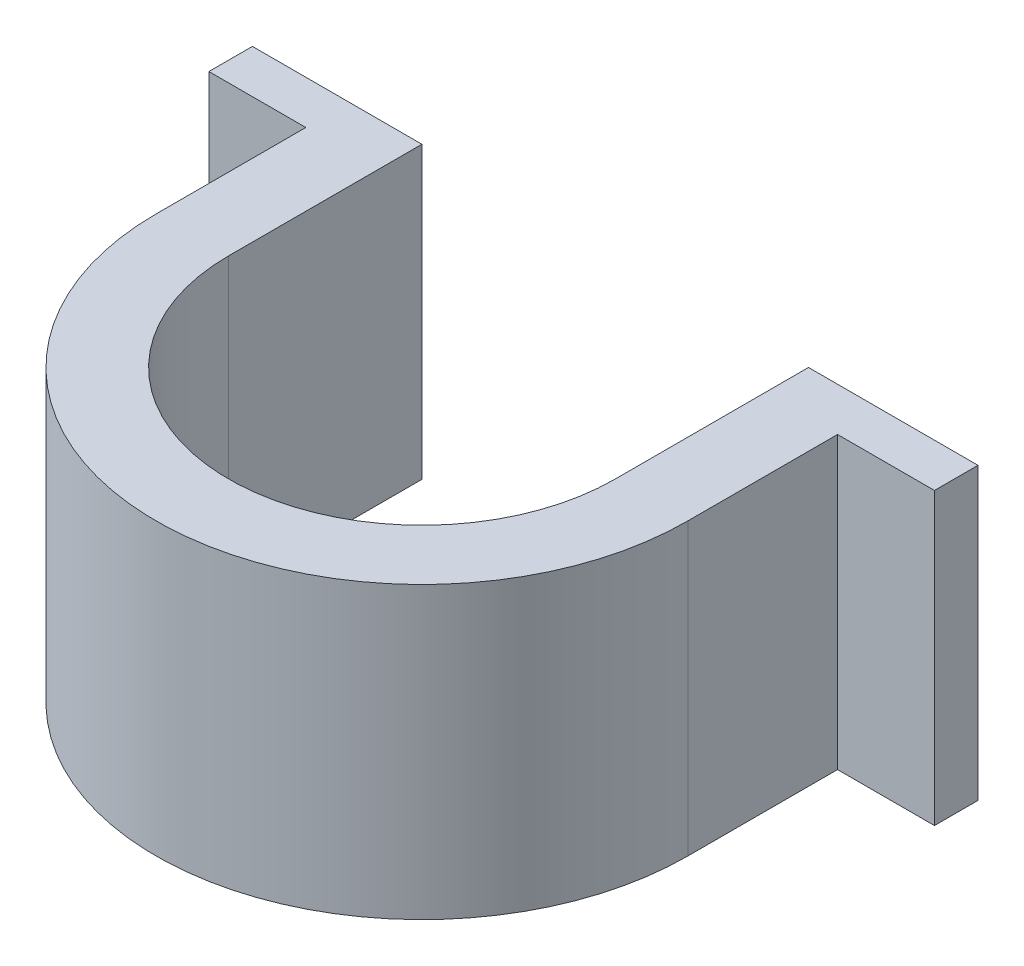
ISO-10303-21;
HEADER;
FILE_DESCRIPTION(('STEP AP214'),'2;1');
FILE_NAME('part.step','',(''),(''),'','','');
FILE_SCHEMA(('AUTOMOTIVE_DESIGN { 1 0 10303 214 1 1 1 1 }'));
ENDSEC;
DATA;
#1=APPLICATION_CONTEXT('core data for automotive mechanical design processes');
#2=APPLICATION_PROTOCOL_DEFINITION('international standard','automotive_design',2000,#1);
#3=PRODUCT_CONTEXT('',#1,'mechanical');
#4=PRODUCT('Part','Part','',(#3));
#5=PRODUCT_RELATED_PRODUCT_CATEGORY('part','',(#4));
#6=PRODUCT_DEFINITION_FORMATION('','',#4);
#7=PRODUCT_DEFINITION_CONTEXT('part definition',#1,'design');
#8=PRODUCT_DEFINITION('design','',#6,#7);
#9=PRODUCT_DEFINITION_SHAPE('','',#8);
#10=(LENGTH_UNIT() NAMED_UNIT(*) SI_UNIT(.MILLI.,.METRE.));
#11=(NAMED_UNIT(*) PLANE_ANGLE_UNIT() SI_UNIT($,.RADIAN.));
#12=(NAMED_UNIT(*) SI_UNIT($,.STERADIAN.) SOLID_ANGLE_UNIT());
#13=UNCERTAINTY_MEASURE_WITH_UNIT(LENGTH_MEASURE(1.E-05),#10,'distance_accuracy_value','');
#14=(GEOMETRIC_REPRESENTATION_CONTEXT(3) GLOBAL_UNCERTAINTY_ASSIGNED_CONTEXT((#13)) GLOBAL_UNIT_ASSIGNED_CONTEXT((#10,
#11,#12)) REPRESENTATION_CONTEXT('',''));
#15=CARTESIAN_POINT('',(0.,0.,0.));
#16=DIRECTION('',(0.,0.,1.));
#17=DIRECTION('',(1.,0.,0.));
#18=AXIS2_PLACEMENT_3D('',#15,#16,#17);
#19=CARTESIAN_POINT('',(-18.32,20.,0.));
#20=DIRECTION('',(-1.,0.,0.));
#21=DIRECTION('',(0.,0.,1.));
#22=AXIS2_PLACEMENT_3D('',#19,#20,#21);
#23=PLANE('',#22);
#24=DIRECTION('',(0.,0.,-1.));
#25=VECTOR('',#24,1.);
#26=CARTESIAN_POINT('',(-18.32,0.,0.));
#27=LINE('',#26,#25);
#28=CARTESIAN_POINT('',(-18.32,0.,0.));
#29=VERTEX_POINT('',#28);
#30=CARTESIAN_POINT('',(-18.32,0.,-10.32));
#31=VERTEX_POINT('',#30);
#32=EDGE_CURVE('E155',#29,#31,#27,.T.);
#33=ORIENTED_EDGE('',*,*,#32,.F.);
#34=DIRECTION('',(0.,-1.,0.));
#35=VECTOR('',#34,1.);
#36=CARTESIAN_POINT('',(-18.32,20.,0.));
#37=LINE('',#36,#35);
#38=CARTESIAN_POINT('',(-18.32,20.,0.));
#39=VERTEX_POINT('',#38);
#40=EDGE_CURVE('E11',#39,#29,#37,.T.);
#41=ORIENTED_EDGE('',*,*,#40,.F.);
#42=DIRECTION('',(0.,0.,-1.));
#43=VECTOR('',#42,1.);
#44=CARTESIAN_POINT('',(-18.32,20.,0.));
#45=LINE('',#44,#43);
#46=CARTESIAN_POINT('',(-18.32,20.,-10.32));
#47=VERTEX_POINT('',#46);
#48=EDGE_CURVE('E184',#39,#47,#45,.T.);
#49=ORIENTED_EDGE('',*,*,#48,.T.);
#50=DIRECTION('',(0.,-1.,0.));
#51=VECTOR('',#50,1.);
#52=CARTESIAN_POINT('',(-18.32,20.,-10.32));
#53=LINE('',#52,#51);
#54=EDGE_CURVE('E100',#47,#31,#53,.T.);
#55=ORIENTED_EDGE('',*,*,#54,.T.);
#56=EDGE_LOOP('',(#33,#41,#49,#55));
#57=FACE_BOUND('',#56,.T.);
#58=ADVANCED_FACE('F37',(#57),#23,.T.);
#59=CARTESIAN_POINT('',(0.,20.,0.));
#60=DIRECTION('',(0.,-1.,0.));
#61=DIRECTION('',(0.,0.,-1.));
#62=AXIS2_PLACEMENT_3D('',#59,#60,#61);
#63=CYLINDRICAL_SURFACE('',#62,18.32);
#64=CARTESIAN_POINT('',(0.,0.,0.));
#65=DIRECTION('',(0.,1.,0.));
#66=DIRECTION('',(0.,0.,1.));
#67=AXIS2_PLACEMENT_3D('',#64,#65,#66);
#68=CIRCLE('',#67,18.32);
#69=CARTESIAN_POINT('',(18.32,0.,0.));
#70=VERTEX_POINT('',#69);
#71=EDGE_CURVE('E158',#29,#70,#68,.T.);
#72=ORIENTED_EDGE('',*,*,#71,.T.);
#73=DIRECTION('',(0.,-1.,0.));
#74=VECTOR('',#73,1.);
#75=CARTESIAN_POINT('',(18.32,20.,0.));
#76=LINE('',#75,#74);
#77=CARTESIAN_POINT('',(18.32,20.,0.));
#78=VERTEX_POINT('',#77);
#79=EDGE_CURVE('E45',#78,#70,#76,.T.);
#80=ORIENTED_EDGE('',*,*,#79,.F.);
#81=CARTESIAN_POINT('',(0.,20.,0.));
#82=DIRECTION('',(0.,1.,0.));
#83=DIRECTION('',(0.,0.,1.));
#84=AXIS2_PLACEMENT_3D('',#81,#82,#83);
#85=CIRCLE('',#84,18.32);
#86=EDGE_CURVE('E224',#39,#78,#85,.T.);
#87=ORIENTED_EDGE('',*,*,#86,.F.);
#88=ORIENTED_EDGE('',*,*,#40,.T.);
#89=EDGE_LOOP('',(#72,#80,#87,#88));
#90=FACE_BOUND('',#89,.T.);
#91=ADVANCED_FACE('F256',(#90),#63,.T.);
#92=CARTESIAN_POINT('',(18.32,20.,0.));
#93=DIRECTION('',(-1.,0.,0.));
#94=DIRECTION('',(0.,0.,1.));
#95=AXIS2_PLACEMENT_3D('',#92,#93,#94);
#96=PLANE('',#95);
#97=DIRECTION('',(0.,0.,-1.));
#98=VECTOR('',#97,1.);
#99=CARTESIAN_POINT('',(18.32,0.,0.));
#100=LINE('',#99,#98);
#101=CARTESIAN_POINT('',(18.32,0.,-10.32));
#102=VERTEX_POINT('',#101);
#103=EDGE_CURVE('E160',#70,#102,#100,.T.);
#104=ORIENTED_EDGE('',*,*,#103,.T.);
#105=DIRECTION('',(0.,-1.,0.));
#106=VECTOR('',#105,1.);
#107=CARTESIAN_POINT('',(18.32,20.,-10.32));
#108=LINE('',#107,#106);
#109=CARTESIAN_POINT('',(18.32,20.,-10.32));
#110=VERTEX_POINT('',#109);
#111=EDGE_CURVE('E198',#110,#102,#108,.T.);
#112=ORIENTED_EDGE('',*,*,#111,.F.);
#113=DIRECTION('',(0.,0.,-1.));
#114=VECTOR('',#113,1.);
#115=CARTESIAN_POINT('',(18.32,20.,0.));
#116=LINE('',#115,#114);
#117=EDGE_CURVE('E206',#78,#110,#116,.T.);
#118=ORIENTED_EDGE('',*,*,#117,.F.);
#119=ORIENTED_EDGE('',*,*,#79,.T.);
#120=EDGE_LOOP('',(#104,#112,#118,#119));
#121=FACE_BOUND('',#120,.T.);
#122=ADVANCED_FACE('F204',(#121),#96,.F.);
#123=CARTESIAN_POINT('',(0.,20.,-10.32));
#124=DIRECTION('',(0.,0.,1.));
#125=DIRECTION('',(1.,0.,0.));
#126=AXIS2_PLACEMENT_3D('',#123,#124,#125);
#127=PLANE('',#126);
#128=DIRECTION('',(-1.,0.,0.));
#129=VECTOR('',#128,1.);
#130=CARTESIAN_POINT('',(0.,0.,-10.32));
#131=LINE('',#130,#129);
#132=CARTESIAN_POINT('',(25.,0.,-10.32));
#133=VERTEX_POINT('',#132);
#134=EDGE_CURVE('E163',#133,#102,#131,.T.);
#135=ORIENTED_EDGE('',*,*,#134,.F.);
#136=DIRECTION('',(0.,-1.,0.));
#137=VECTOR('',#136,1.);
#138=CARTESIAN_POINT('',(25.,20.,-10.32));
#139=LINE('',#138,#137);
#140=CARTESIAN_POINT('',(25.,20.,-10.32));
#141=VERTEX_POINT('',#140);
#142=EDGE_CURVE('E196',#141,#133,#139,.T.);
#143=ORIENTED_EDGE('',*,*,#142,.F.);
#144=DIRECTION('',(-1.,0.,0.));
#145=VECTOR('',#144,1.);
#146=CARTESIAN_POINT('',(0.,20.,-10.32));
#147=LINE('',#146,#145);
#148=EDGE_CURVE('E217',#141,#110,#147,.T.);
#149=ORIENTED_EDGE('',*,*,#148,.T.);
#150=ORIENTED_EDGE('',*,*,#111,.T.);
#151=EDGE_LOOP('',(#135,#143,#149,#150));
#152=FACE_BOUND('',#151,.T.);
#153=ADVANCED_FACE('F214',(#152),#127,.T.);
#154=CARTESIAN_POINT('',(25.,20.,0.));
#155=DIRECTION('',(1.,0.,0.));
#156=DIRECTION('',(0.,0.,-1.));
#157=AXIS2_PLACEMENT_3D('',#154,#155,#156);
#158=PLANE('',#157);
#159=DIRECTION('',(0.,0.,1.));
#160=VECTOR('',#159,1.);
#161=CARTESIAN_POINT('',(25.,0.,0.));
#162=LINE('',#161,#160);
#163=CARTESIAN_POINT('',(25.,0.,-13.32));
#164=VERTEX_POINT('',#163);
#165=EDGE_CURVE('E166',#164,#133,#162,.T.);
#166=ORIENTED_EDGE('',*,*,#165,.F.);
#167=DIRECTION('',(0.,-1.,0.));
#168=VECTOR('',#167,1.);
#169=CARTESIAN_POINT('',(25.,20.,-13.32));
#170=LINE('',#169,#168);
#171=CARTESIAN_POINT('',(25.,20.,-13.32));
#172=VERTEX_POINT('',#171);
#173=EDGE_CURVE('E194',#172,#164,#170,.T.);
#174=ORIENTED_EDGE('',*,*,#173,.F.);
#175=DIRECTION('',(0.,0.,1.));
#176=VECTOR('',#175,1.);
#177=CARTESIAN_POINT('',(25.,20.,0.));
#178=LINE('',#177,#176);
#179=EDGE_CURVE('E220',#172,#141,#178,.T.);
#180=ORIENTED_EDGE('',*,*,#179,.T.);
#181=ORIENTED_EDGE('',*,*,#142,.T.);
#182=EDGE_LOOP('',(#166,#174,#180,#181));
#183=FACE_BOUND('',#182,.T.);
#184=ADVANCED_FACE('F324',(#183),#158,.T.);
#185=CARTESIAN_POINT('',(0.,20.,-13.32));
#186=DIRECTION('',(0.,0.,-1.));
#187=DIRECTION('',(-1.,0.,0.));
#188=AXIS2_PLACEMENT_3D('',#185,#186,#187);
#189=PLANE('',#188);
#190=DIRECTION('',(1.,0.,0.));
#191=VECTOR('',#190,1.);
#192=CARTESIAN_POINT('',(0.,0.,-13.32));
#193=LINE('',#192,#191);
#194=CARTESIAN_POINT('',(13.32,0.,-13.32));
#195=VERTEX_POINT('',#194);
#196=EDGE_CURVE('E169',#195,#164,#193,.T.);
#197=ORIENTED_EDGE('',*,*,#196,.F.);
#198=DIRECTION('',(0.,-1.,0.));
#199=VECTOR('',#198,1.);
#200=CARTESIAN_POINT('',(13.32,20.,-13.32));
#201=LINE('',#200,#199);
#202=CARTESIAN_POINT('',(13.32,20.,-13.32));
#203=VERTEX_POINT('',#202);
#204=EDGE_CURVE('E192',#203,#195,#201,.T.);
#205=ORIENTED_EDGE('',*,*,#204,.F.);
#206=DIRECTION('',(1.,0.,0.));
#207=VECTOR('',#206,1.);
#208=CARTESIAN_POINT('',(0.,20.,-13.32));
#209=LINE('',#208,#207);
#210=EDGE_CURVE('E222',#203,#172,#209,.T.);
#211=ORIENTED_EDGE('',*,*,#210,.T.);
#212=ORIENTED_EDGE('',*,*,#173,.T.);
#213=EDGE_LOOP('',(#197,#205,#211,#212));
#214=FACE_BOUND('',#213,.T.);
#215=ADVANCED_FACE('F315',(#214),#189,.T.);
#216=CARTESIAN_POINT('',(13.32,20.,0.));
#217=DIRECTION('',(-1.,0.,0.));
#218=DIRECTION('',(0.,0.,1.));
#219=AXIS2_PLACEMENT_3D('',#216,#217,#218);
#220=PLANE('',#219);
#221=DIRECTION('',(0.,0.,-1.));
#222=VECTOR('',#221,1.);
#223=CARTESIAN_POINT('',(13.32,0.,0.));
#224=LINE('',#223,#222);
#225=CARTESIAN_POINT('',(13.32,0.,0.));
#226=VERTEX_POINT('',#225);
#227=EDGE_CURVE('E172',#226,#195,#224,.T.);
#228=ORIENTED_EDGE('',*,*,#227,.F.);
#229=DIRECTION('',(0.,-1.,0.));
#230=VECTOR('',#229,1.);
#231=CARTESIAN_POINT('',(13.32,20.,0.));
#232=LINE('',#231,#230);
#233=CARTESIAN_POINT('',(13.32,20.,0.));
#234=VERTEX_POINT('',#233);
#235=EDGE_CURVE('E190',#234,#226,#232,.T.);
#236=ORIENTED_EDGE('',*,*,#235,.F.);
#237=DIRECTION('',(0.,0.,-1.));
#238=VECTOR('',#237,1.);
#239=CARTESIAN_POINT('',(13.32,20.,0.));
#240=LINE('',#239,#238);
#241=EDGE_CURVE('E230',#234,#203,#240,.T.);
#242=ORIENTED_EDGE('',*,*,#241,.T.);
#243=ORIENTED_EDGE('',*,*,#204,.T.);
#244=EDGE_LOOP('',(#228,#236,#242,#243));
#245=FACE_BOUND('',#244,.T.);
#246=ADVANCED_FACE('F242',(#245),#220,.T.);
#247=CARTESIAN_POINT('',(0.,20.,0.));
#248=DIRECTION('',(0.,-1.,0.));
#249=DIRECTION('',(0.,0.,-1.));
#250=AXIS2_PLACEMENT_3D('',#247,#248,#249);
#251=CYLINDRICAL_SURFACE('',#250,13.32);
#252=CARTESIAN_POINT('',(0.,0.,0.));
#253=DIRECTION('',(0.,1.,0.));
#254=DIRECTION('',(0.,0.,1.));
#255=AXIS2_PLACEMENT_3D('',#252,#253,#254);
#256=CIRCLE('',#255,13.32);
#257=CARTESIAN_POINT('',(-13.32,0.,0.));
#258=VERTEX_POINT('',#257);
#259=EDGE_CURVE('E175',#258,#226,#256,.T.);
#260=ORIENTED_EDGE('',*,*,#259,.F.);
#261=DIRECTION('',(0.,-1.,0.));
#262=VECTOR('',#261,1.);
#263=CARTESIAN_POINT('',(-13.32,20.,0.));
#264=LINE('',#263,#262);
#265=CARTESIAN_POINT('',(-13.32,20.,0.));
#266=VERTEX_POINT('',#265);
#267=EDGE_CURVE('E188',#266,#258,#264,.T.);
#268=ORIENTED_EDGE('',*,*,#267,.F.);
#269=CARTESIAN_POINT('',(0.,20.,0.));
#270=DIRECTION('',(0.,1.,0.));
#271=DIRECTION('',(0.,0.,1.));
#272=AXIS2_PLACEMENT_3D('',#269,#270,#271);
#273=CIRCLE('',#272,13.32);
#274=EDGE_CURVE('E233',#266,#234,#273,.T.);
#275=ORIENTED_EDGE('',*,*,#274,.T.);
#276=ORIENTED_EDGE('',*,*,#235,.T.);
#277=EDGE_LOOP('',(#260,#268,#275,#276));
#278=FACE_BOUND('',#277,.T.);
#279=ADVANCED_FACE('F237',(#278),#251,.F.);
#280=CARTESIAN_POINT('',(-13.32,20.,0.));
#281=DIRECTION('',(-1.,0.,0.));
#282=DIRECTION('',(0.,0.,1.));
#283=AXIS2_PLACEMENT_3D('',#280,#281,#282);
#284=PLANE('',#283);
#285=DIRECTION('',(0.,0.,-1.));
#286=VECTOR('',#285,1.);
#287=CARTESIAN_POINT('',(-13.32,0.,0.));
#288=LINE('',#287,#286);
#289=CARTESIAN_POINT('',(-13.32,0.,-13.32));
#290=VERTEX_POINT('',#289);
#291=EDGE_CURVE('E178',#258,#290,#288,.T.);
#292=ORIENTED_EDGE('',*,*,#291,.T.);
#293=DIRECTION('',(0.,-1.,0.));
#294=VECTOR('',#293,1.);
#295=CARTESIAN_POINT('',(-13.32,20.,-13.32));
#296=LINE('',#295,#294);
#297=CARTESIAN_POINT('',(-13.32,20.,-13.32));
#298=VERTEX_POINT('',#297);
#299=EDGE_CURVE('E147',#298,#290,#296,.T.);
#300=ORIENTED_EDGE('',*,*,#299,.F.);
#301=DIRECTION('',(0.,0.,-1.));
#302=VECTOR('',#301,1.);
#303=CARTESIAN_POINT('',(-13.32,20.,0.));
#304=LINE('',#303,#302);
#305=EDGE_CURVE('E138',#266,#298,#304,.T.);
#306=ORIENTED_EDGE('',*,*,#305,.F.);
#307=ORIENTED_EDGE('',*,*,#267,.T.);
#308=EDGE_LOOP('',(#292,#300,#306,#307));
#309=FACE_BOUND('',#308,.T.);
#310=ADVANCED_FACE('F246',(#309),#284,.F.);
#311=CARTESIAN_POINT('',(0.,20.,-13.32));
#312=DIRECTION('',(0.,0.,1.));
#313=DIRECTION('',(1.,0.,0.));
#314=AXIS2_PLACEMENT_3D('',#311,#312,#313);
#315=PLANE('',#314);
#316=DIRECTION('',(-1.,0.,0.));
#317=VECTOR('',#316,1.);
#318=CARTESIAN_POINT('',(0.,0.,-13.32));
#319=LINE('',#318,#317);
#320=CARTESIAN_POINT('',(-25.,0.,-13.32));
#321=VERTEX_POINT('',#320);
#322=EDGE_CURVE('E146',#290,#321,#319,.T.);
#323=ORIENTED_EDGE('',*,*,#322,.T.);
#324=DIRECTION('',(0.,-1.,0.));
#325=VECTOR('',#324,1.);
#326=CARTESIAN_POINT('',(-25.,20.,-13.32));
#327=LINE('',#326,#325);
#328=CARTESIAN_POINT('',(-25.,20.,-13.32));
#329=VERTEX_POINT('',#328);
#330=EDGE_CURVE('E143',#329,#321,#327,.T.);
#331=ORIENTED_EDGE('',*,*,#330,.F.);
#332=DIRECTION('',(-1.,0.,0.));
#333=VECTOR('',#332,1.);
#334=CARTESIAN_POINT('',(0.,20.,-13.32));
#335=LINE('',#334,#333);
#336=EDGE_CURVE('E131',#298,#329,#335,.T.);
#337=ORIENTED_EDGE('',*,*,#336,.F.);
#338=ORIENTED_EDGE('',*,*,#299,.T.);
#339=EDGE_LOOP('',(#323,#331,#337,#338));
#340=FACE_BOUND('',#339,.T.);
#341=ADVANCED_FACE('F144',(#340),#315,.F.);
#342=CARTESIAN_POINT('',(-25.,20.,0.));
#343=DIRECTION('',(1.,0.,0.));
#344=DIRECTION('',(0.,0.,-1.));
#345=AXIS2_PLACEMENT_3D('',#342,#343,#344);
#346=PLANE('',#345);
#347=DIRECTION('',(0.,0.,1.));
#348=VECTOR('',#347,1.);
#349=CARTESIAN_POINT('',(-25.,0.,0.));
#350=LINE('',#349,#348);
#351=CARTESIAN_POINT('',(-25.,0.,-10.32));
#352=VERTEX_POINT('',#351);
#353=EDGE_CURVE('E93',#321,#352,#350,.T.);
#354=ORIENTED_EDGE('',*,*,#353,.T.);
#355=DIRECTION('',(0.,-1.,0.));
#356=VECTOR('',#355,1.);
#357=CARTESIAN_POINT('',(-25.,20.,-10.32));
#358=LINE('',#357,#356);
#359=CARTESIAN_POINT('',(-25.,20.,-10.32));
#360=VERTEX_POINT('',#359);
#361=EDGE_CURVE('E148',#360,#352,#358,.T.);
#362=ORIENTED_EDGE('',*,*,#361,.F.);
#363=DIRECTION('',(0.,0.,1.));
#364=VECTOR('',#363,1.);
#365=CARTESIAN_POINT('',(-25.,20.,0.));
#366=LINE('',#365,#364);
#367=EDGE_CURVE('E135',#329,#360,#366,.T.);
#368=ORIENTED_EDGE('',*,*,#367,.F.);
#369=ORIENTED_EDGE('',*,*,#330,.T.);
#370=EDGE_LOOP('',(#354,#362,#368,#369));
#371=FACE_BOUND('',#370,.T.);
#372=ADVANCED_FACE('F150',(#371),#346,.F.);
#373=CARTESIAN_POINT('',(0.,20.,-10.32));
#374=DIRECTION('',(0.,0.,-1.));
#375=DIRECTION('',(-1.,0.,0.));
#376=AXIS2_PLACEMENT_3D('',#373,#374,#375);
#377=PLANE('',#376);
#378=DIRECTION('',(1.,0.,0.));
#379=VECTOR('',#378,1.);
#380=CARTESIAN_POINT('',(0.,0.,-10.32));
#381=LINE('',#380,#379);
#382=EDGE_CURVE('E182',#352,#31,#381,.T.);
#383=ORIENTED_EDGE('',*,*,#382,.T.);
#384=ORIENTED_EDGE('',*,*,#54,.F.);
#385=DIRECTION('',(1.,0.,0.));
#386=VECTOR('',#385,1.);
#387=CARTESIAN_POINT('',(0.,20.,-10.32));
#388=LINE('',#387,#386);
#389=EDGE_CURVE('E53',#360,#47,#388,.T.);
#390=ORIENTED_EDGE('',*,*,#389,.F.);
#391=ORIENTED_EDGE('',*,*,#361,.T.);
#392=EDGE_LOOP('',(#383,#384,#390,#391));
#393=FACE_BOUND('',#392,.T.);
#394=ADVANCED_FACE('F262',(#393),#377,.F.);
#395=CARTESIAN_POINT('',(0.,20.,0.));
#396=DIRECTION('',(0.,1.,0.));
#397=DIRECTION('',(0.,0.,1.));
#398=AXIS2_PLACEMENT_3D('',#395,#396,#397);
#399=PLANE('',#398);
#400=ORIENTED_EDGE('',*,*,#48,.F.);
#401=ORIENTED_EDGE('',*,*,#86,.T.);
#402=ORIENTED_EDGE('',*,*,#117,.T.);
#403=ORIENTED_EDGE('',*,*,#148,.F.);
#404=ORIENTED_EDGE('',*,*,#179,.F.);
#405=ORIENTED_EDGE('',*,*,#210,.F.);
#406=ORIENTED_EDGE('',*,*,#241,.F.);
#407=ORIENTED_EDGE('',*,*,#274,.F.);
#408=ORIENTED_EDGE('',*,*,#305,.T.);
#409=ORIENTED_EDGE('',*,*,#336,.T.);
#410=ORIENTED_EDGE('',*,*,#367,.T.);
#411=ORIENTED_EDGE('',*,*,#389,.T.);
#412=EDGE_LOOP('',(#400,#401,#402,#403,#404,#405,#406,#407,#408,#409,#410,#411));
#413=FACE_BOUND('',#412,.T.);
#414=ADVANCED_FACE('F133',(#413),#399,.T.);
#415=CARTESIAN_POINT('',(0.,0.,0.));
#416=DIRECTION('',(0.,1.,0.));
#417=DIRECTION('',(0.,0.,1.));
#418=AXIS2_PLACEMENT_3D('',#415,#416,#417);
#419=PLANE('',#418);
#420=ORIENTED_EDGE('',*,*,#32,.T.);
#421=ORIENTED_EDGE('',*,*,#382,.F.);
#422=ORIENTED_EDGE('',*,*,#353,.F.);
#423=ORIENTED_EDGE('',*,*,#322,.F.);
#424=ORIENTED_EDGE('',*,*,#291,.F.);
#425=ORIENTED_EDGE('',*,*,#259,.T.);
#426=ORIENTED_EDGE('',*,*,#227,.T.);
#427=ORIENTED_EDGE('',*,*,#196,.T.);
#428=ORIENTED_EDGE('',*,*,#165,.T.);
#429=ORIENTED_EDGE('',*,*,#134,.T.);
#430=ORIENTED_EDGE('',*,*,#103,.F.);
#431=ORIENTED_EDGE('',*,*,#71,.F.);
#432=EDGE_LOOP('',(#420,#421,#422,#423,#424,#425,#426,#427,#428,#429,#430,#431));
#433=FACE_BOUND('',#432,.T.);
#434=ADVANCED_FACE('F210',(#433),#419,.F.);
#435=CLOSED_SHELL('',(#58,#91,#122,#153,#184,#215,#246,#279,#310,#341,#372,#394,#414,#434));
#436=MANIFOLD_SOLID_BREP('B2',#435);
#437=ADVANCED_BREP_SHAPE_REPRESENTATION('',(#18,#436),#14);
#438=SHAPE_DEFINITION_REPRESENTATION(#9,#437);
ENDSEC;
END-ISO-10303-21;
